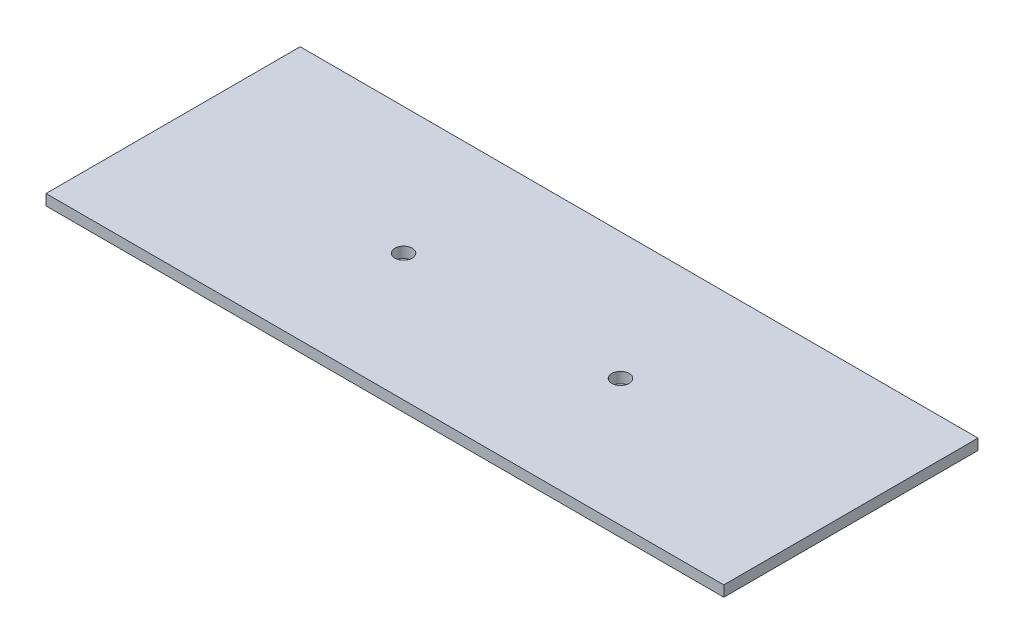
ISO-10303-21;
HEADER;
FILE_DESCRIPTION(('STEP AP214'),'2;1');
FILE_NAME('part.step','',(''),(''),'','','');
FILE_SCHEMA(('AUTOMOTIVE_DESIGN { 1 0 10303 214 1 1 1 1 }'));
ENDSEC;
DATA;
#1=APPLICATION_CONTEXT('core data for automotive mechanical design processes');
#2=APPLICATION_PROTOCOL_DEFINITION('international standard','automotive_design',2000,#1);
#3=PRODUCT_CONTEXT('',#1,'mechanical');
#4=PRODUCT('Part','Part','',(#3));
#5=PRODUCT_RELATED_PRODUCT_CATEGORY('part','',(#4));
#6=PRODUCT_DEFINITION_FORMATION('','',#4);
#7=PRODUCT_DEFINITION_CONTEXT('part definition',#1,'design');
#8=PRODUCT_DEFINITION('design','',#6,#7);
#9=PRODUCT_DEFINITION_SHAPE('','',#8);
#10=(LENGTH_UNIT() NAMED_UNIT(*) SI_UNIT(.MILLI.,.METRE.));
#11=(NAMED_UNIT(*) PLANE_ANGLE_UNIT() SI_UNIT($,.RADIAN.));
#12=(NAMED_UNIT(*) SI_UNIT($,.STERADIAN.) SOLID_ANGLE_UNIT());
#13=UNCERTAINTY_MEASURE_WITH_UNIT(LENGTH_MEASURE(1.E-05),#10,'distance_accuracy_value','');
#14=(GEOMETRIC_REPRESENTATION_CONTEXT(3) GLOBAL_UNCERTAINTY_ASSIGNED_CONTEXT((#13)) GLOBAL_UNIT_ASSIGNED_CONTEXT((#10,
#11,#12)) REPRESENTATION_CONTEXT('',''));
#15=CARTESIAN_POINT('',(0.,0.,0.));
#16=DIRECTION('',(0.,0.,1.));
#17=DIRECTION('',(1.,0.,0.));
#18=AXIS2_PLACEMENT_3D('',#15,#16,#17);
#19=CARTESIAN_POINT('',(100.,3.175,37.5));
#20=DIRECTION('',(-1.,0.,0.));
#21=DIRECTION('',(0.,0.,1.));
#22=AXIS2_PLACEMENT_3D('',#19,#20,#21);
#23=PLANE('',#22);
#24=DIRECTION('',(0.,0.,-1.));
#25=VECTOR('',#24,1.);
#26=CARTESIAN_POINT('',(100.,0.,37.5));
#27=LINE('',#26,#25);
#28=CARTESIAN_POINT('',(100.,0.,37.5));
#29=VERTEX_POINT('',#28);
#30=CARTESIAN_POINT('',(100.,0.,-37.5));
#31=VERTEX_POINT('',#30);
#32=EDGE_CURVE('E107',#29,#31,#27,.T.);
#33=ORIENTED_EDGE('',*,*,#32,.T.);
#34=DIRECTION('',(0.,-1.,0.));
#35=VECTOR('',#34,1.);
#36=CARTESIAN_POINT('',(100.,3.175,-37.5));
#37=LINE('',#36,#35);
#38=CARTESIAN_POINT('',(100.,3.175,-37.5));
#39=VERTEX_POINT('',#38);
#40=EDGE_CURVE('E11',#39,#31,#37,.T.);
#41=ORIENTED_EDGE('',*,*,#40,.F.);
#42=DIRECTION('',(0.,0.,-1.));
#43=VECTOR('',#42,1.);
#44=CARTESIAN_POINT('',(100.,3.175,37.5));
#45=LINE('',#44,#43);
#46=CARTESIAN_POINT('',(100.,3.175,37.5));
#47=VERTEX_POINT('',#46);
#48=EDGE_CURVE('E91',#47,#39,#45,.T.);
#49=ORIENTED_EDGE('',*,*,#48,.F.);
#50=DIRECTION('',(0.,-1.,0.));
#51=VECTOR('',#50,1.);
#52=CARTESIAN_POINT('',(100.,3.175,37.5));
#53=LINE('',#52,#51);
#54=EDGE_CURVE('E103',#47,#29,#53,.T.);
#55=ORIENTED_EDGE('',*,*,#54,.T.);
#56=EDGE_LOOP('',(#33,#41,#49,#55));
#57=FACE_BOUND('',#56,.T.);
#58=ADVANCED_FACE('F39',(#57),#23,.F.);
#59=CARTESIAN_POINT('',(-100.,3.175,-37.5));
#60=DIRECTION('',(0.,0.,1.));
#61=DIRECTION('',(1.,0.,0.));
#62=AXIS2_PLACEMENT_3D('',#59,#60,#61);
#63=PLANE('',#62);
#64=DIRECTION('',(-1.,0.,0.));
#65=VECTOR('',#64,1.);
#66=CARTESIAN_POINT('',(-100.,0.,-37.5));
#67=LINE('',#66,#65);
#68=CARTESIAN_POINT('',(-100.,0.,-37.5));
#69=VERTEX_POINT('',#68);
#70=EDGE_CURVE('E96',#31,#69,#67,.T.);
#71=ORIENTED_EDGE('',*,*,#70,.T.);
#72=DIRECTION('',(0.,-1.,0.));
#73=VECTOR('',#72,1.);
#74=CARTESIAN_POINT('',(-100.,3.175,-37.5));
#75=LINE('',#74,#73);
#76=CARTESIAN_POINT('',(-100.,3.175,-37.5));
#77=VERTEX_POINT('',#76);
#78=EDGE_CURVE('E48',#77,#69,#75,.T.);
#79=ORIENTED_EDGE('',*,*,#78,.F.);
#80=DIRECTION('',(-1.,0.,0.));
#81=VECTOR('',#80,1.);
#82=CARTESIAN_POINT('',(-100.,3.175,-37.5));
#83=LINE('',#82,#81);
#84=EDGE_CURVE('E86',#39,#77,#83,.T.);
#85=ORIENTED_EDGE('',*,*,#84,.F.);
#86=ORIENTED_EDGE('',*,*,#40,.T.);
#87=EDGE_LOOP('',(#71,#79,#85,#86));
#88=FACE_BOUND('',#87,.T.);
#89=ADVANCED_FACE('F95',(#88),#63,.F.);
#90=CARTESIAN_POINT('',(-100.,3.175,37.5));
#91=DIRECTION('',(1.,0.,0.));
#92=DIRECTION('',(0.,0.,-1.));
#93=AXIS2_PLACEMENT_3D('',#90,#91,#92);
#94=PLANE('',#93);
#95=DIRECTION('',(0.,0.,1.));
#96=VECTOR('',#95,1.);
#97=CARTESIAN_POINT('',(-100.,0.,37.5));
#98=LINE('',#97,#96);
#99=CARTESIAN_POINT('',(-100.,0.,37.5));
#100=VERTEX_POINT('',#99);
#101=EDGE_CURVE('E73',#69,#100,#98,.T.);
#102=ORIENTED_EDGE('',*,*,#101,.T.);
#103=DIRECTION('',(0.,-1.,0.));
#104=VECTOR('',#103,1.);
#105=CARTESIAN_POINT('',(-100.,3.175,37.5));
#106=LINE('',#105,#104);
#107=CARTESIAN_POINT('',(-100.,3.175,37.5));
#108=VERTEX_POINT('',#107);
#109=EDGE_CURVE('E98',#108,#100,#106,.T.);
#110=ORIENTED_EDGE('',*,*,#109,.F.);
#111=DIRECTION('',(0.,0.,1.));
#112=VECTOR('',#111,1.);
#113=CARTESIAN_POINT('',(-100.,3.175,37.5));
#114=LINE('',#113,#112);
#115=EDGE_CURVE('E89',#77,#108,#114,.T.);
#116=ORIENTED_EDGE('',*,*,#115,.F.);
#117=ORIENTED_EDGE('',*,*,#78,.T.);
#118=EDGE_LOOP('',(#102,#110,#116,#117));
#119=FACE_BOUND('',#118,.T.);
#120=ADVANCED_FACE('F99',(#119),#94,.F.);
#121=CARTESIAN_POINT('',(-100.,3.175,37.5));
#122=DIRECTION('',(0.,0.,-1.));
#123=DIRECTION('',(-1.,0.,0.));
#124=AXIS2_PLACEMENT_3D('',#121,#122,#123);
#125=PLANE('',#124);
#126=DIRECTION('',(1.,0.,0.));
#127=VECTOR('',#126,1.);
#128=CARTESIAN_POINT('',(-100.,0.,37.5));
#129=LINE('',#128,#127);
#130=EDGE_CURVE('E79',#100,#29,#129,.T.);
#131=ORIENTED_EDGE('',*,*,#130,.T.);
#132=ORIENTED_EDGE('',*,*,#54,.F.);
#133=DIRECTION('',(1.,0.,0.));
#134=VECTOR('',#133,1.);
#135=CARTESIAN_POINT('',(-100.,3.175,37.5));
#136=LINE('',#135,#134);
#137=EDGE_CURVE('E56',#108,#47,#136,.T.);
#138=ORIENTED_EDGE('',*,*,#137,.F.);
#139=ORIENTED_EDGE('',*,*,#109,.T.);
#140=EDGE_LOOP('',(#131,#132,#138,#139));
#141=FACE_BOUND('',#140,.T.);
#142=ADVANCED_FACE('F121',(#141),#125,.F.);
#143=CARTESIAN_POINT('',(0.,3.175,0.));
#144=DIRECTION('',(0.,-1.,0.));
#145=DIRECTION('',(0.,0.,-1.));
#146=AXIS2_PLACEMENT_3D('',#143,#144,#145);
#147=PLANE('',#146);
#148=CARTESIAN_POINT('',(32.,3.175,0.));
#149=DIRECTION('',(0.,1.,0.));
#150=DIRECTION('',(0.,0.,1.));
#151=AXIS2_PLACEMENT_3D('',#148,#149,#150);
#152=CIRCLE('',#151,2.5527);
#153=CARTESIAN_POINT('',(32.,3.175,2.5527));
#154=VERTEX_POINT('',#153);
#155=EDGE_CURVE('E136',#154,#154,#152,.T.);
#156=ORIENTED_EDGE('',*,*,#155,.F.);
#157=EDGE_LOOP('',(#156));
#158=FACE_BOUND('',#157,.T.);
#159=CARTESIAN_POINT('',(-32.,3.175,0.));
#160=DIRECTION('',(0.,1.,0.));
#161=DIRECTION('',(0.,0.,-1.));
#162=AXIS2_PLACEMENT_3D('',#159,#160,#161);
#163=CIRCLE('',#162,2.5527);
#164=CARTESIAN_POINT('',(-32.,3.175,-2.55269999999997));
#165=VERTEX_POINT('',#164);
#166=EDGE_CURVE('E128',#165,#165,#163,.T.);
#167=ORIENTED_EDGE('',*,*,#166,.F.);
#168=EDGE_LOOP('',(#167));
#169=FACE_BOUND('',#168,.T.);
#170=ORIENTED_EDGE('',*,*,#48,.T.);
#171=ORIENTED_EDGE('',*,*,#84,.T.);
#172=ORIENTED_EDGE('',*,*,#115,.T.);
#173=ORIENTED_EDGE('',*,*,#137,.T.);
#174=EDGE_LOOP('',(#170,#171,#172,#173));
#175=FACE_BOUND('',#174,.T.);
#176=ADVANCED_FACE('F87',(#158,#169,#175),#147,.F.);
#177=CARTESIAN_POINT('',(0.,0.,0.));
#178=DIRECTION('',(0.,-1.,0.));
#179=DIRECTION('',(0.,0.,-1.));
#180=AXIS2_PLACEMENT_3D('',#177,#178,#179);
#181=PLANE('',#180);
#182=CARTESIAN_POINT('',(32.,0.,0.));
#183=DIRECTION('',(0.,1.,0.));
#184=DIRECTION('',(0.,0.,1.));
#185=AXIS2_PLACEMENT_3D('',#182,#183,#184);
#186=CIRCLE('',#185,2.5527);
#187=CARTESIAN_POINT('',(32.,0.,2.5527));
#188=VERTEX_POINT('',#187);
#189=EDGE_CURVE('E111',#188,#188,#186,.T.);
#190=ORIENTED_EDGE('',*,*,#189,.T.);
#191=EDGE_LOOP('',(#190));
#192=FACE_BOUND('',#191,.T.);
#193=CARTESIAN_POINT('',(-32.,0.,0.));
#194=DIRECTION('',(0.,1.,0.));
#195=DIRECTION('',(0.,0.,-1.));
#196=AXIS2_PLACEMENT_3D('',#193,#194,#195);
#197=CIRCLE('',#196,2.5527);
#198=CARTESIAN_POINT('',(-32.,0.,-2.55269999999997));
#199=VERTEX_POINT('',#198);
#200=EDGE_CURVE('E132',#199,#199,#197,.T.);
#201=ORIENTED_EDGE('',*,*,#200,.T.);
#202=EDGE_LOOP('',(#201));
#203=FACE_BOUND('',#202,.T.);
#204=ORIENTED_EDGE('',*,*,#32,.F.);
#205=ORIENTED_EDGE('',*,*,#130,.F.);
#206=ORIENTED_EDGE('',*,*,#101,.F.);
#207=ORIENTED_EDGE('',*,*,#70,.F.);
#208=EDGE_LOOP('',(#204,#205,#206,#207));
#209=FACE_BOUND('',#208,.T.);
#210=ADVANCED_FACE('F124',(#192,#203,#209),#181,.T.);
#211=CARTESIAN_POINT('',(-32.,0.,0.));
#212=DIRECTION('',(0.,1.,0.));
#213=DIRECTION('',(0.,0.,1.));
#214=AXIS2_PLACEMENT_3D('',#211,#212,#213);
#215=CYLINDRICAL_SURFACE('',#214,2.5527);
#216=ORIENTED_EDGE('',*,*,#200,.F.);
#217=EDGE_LOOP('',(#216));
#218=FACE_BOUND('',#217,.T.);
#219=ORIENTED_EDGE('',*,*,#166,.T.);
#220=EDGE_LOOP('',(#219));
#221=FACE_BOUND('',#220,.T.);
#222=ADVANCED_FACE('F149',(#218,#221),#215,.F.);
#223=CARTESIAN_POINT('',(32.,0.,0.));
#224=DIRECTION('',(0.,1.,0.));
#225=DIRECTION('',(0.,0.,1.));
#226=AXIS2_PLACEMENT_3D('',#223,#224,#225);
#227=CYLINDRICAL_SURFACE('',#226,2.5527);
#228=ORIENTED_EDGE('',*,*,#189,.F.);
#229=EDGE_LOOP('',(#228));
#230=FACE_BOUND('',#229,.T.);
#231=ORIENTED_EDGE('',*,*,#155,.T.);
#232=EDGE_LOOP('',(#231));
#233=FACE_BOUND('',#232,.T.);
#234=ADVANCED_FACE('F146',(#230,#233),#227,.F.);
#235=CLOSED_SHELL('',(#58,#89,#120,#142,#176,#210,#222,#234));
#236=MANIFOLD_SOLID_BREP('B2',#235);
#237=ADVANCED_BREP_SHAPE_REPRESENTATION('',(#18,#236),#14);
#238=SHAPE_DEFINITION_REPRESENTATION(#9,#237);
ENDSEC;
END-ISO-10303-21;
